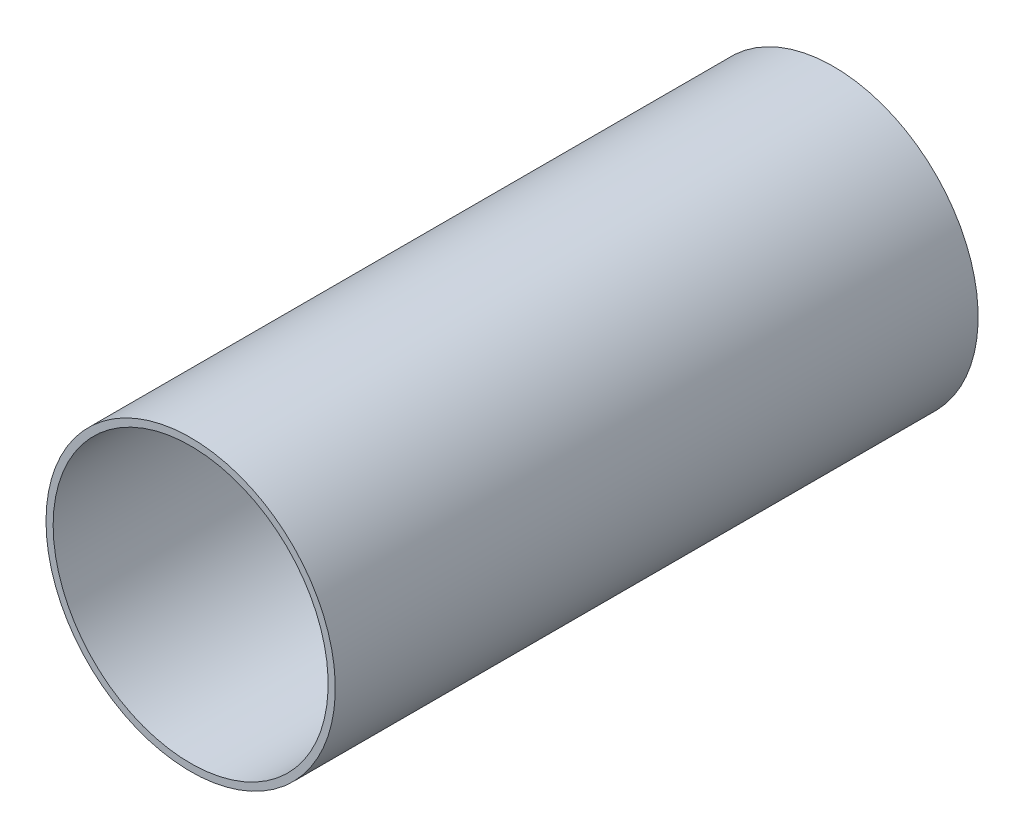
ISO-10303-21;
HEADER;
FILE_DESCRIPTION(('STEP AP214'),'2;1');
FILE_NAME('part.step','',(''),(''),'','','');
FILE_SCHEMA(('AUTOMOTIVE_DESIGN { 1 0 10303 214 1 1 1 1 }'));
ENDSEC;
DATA;
#1=APPLICATION_CONTEXT('core data for automotive mechanical design processes');
#2=APPLICATION_PROTOCOL_DEFINITION('international standard','automotive_design',2000,#1);
#3=PRODUCT_CONTEXT('',#1,'mechanical');
#4=PRODUCT('Part','Part','',(#3));
#5=PRODUCT_RELATED_PRODUCT_CATEGORY('part','',(#4));
#6=PRODUCT_DEFINITION_FORMATION('','',#4);
#7=PRODUCT_DEFINITION_CONTEXT('part definition',#1,'design');
#8=PRODUCT_DEFINITION('design','',#6,#7);
#9=PRODUCT_DEFINITION_SHAPE('','',#8);
#10=(LENGTH_UNIT() NAMED_UNIT(*) SI_UNIT(.MILLI.,.METRE.));
#11=(NAMED_UNIT(*) PLANE_ANGLE_UNIT() SI_UNIT($,.RADIAN.));
#12=(NAMED_UNIT(*) SI_UNIT($,.STERADIAN.) SOLID_ANGLE_UNIT());
#13=UNCERTAINTY_MEASURE_WITH_UNIT(LENGTH_MEASURE(1.E-05),#10,'distance_accuracy_value','');
#14=(GEOMETRIC_REPRESENTATION_CONTEXT(3) GLOBAL_UNCERTAINTY_ASSIGNED_CONTEXT((#13)) GLOBAL_UNIT_ASSIGNED_CONTEXT((#10,
#11,#12)) REPRESENTATION_CONTEXT('',''));
#15=CARTESIAN_POINT('',(0.,0.,0.));
#16=DIRECTION('',(0.,0.,1.));
#17=DIRECTION('',(1.,0.,0.));
#18=AXIS2_PLACEMENT_3D('',#15,#16,#17);
#19=CARTESIAN_POINT('',(0.,0.,90.));
#20=DIRECTION('',(0.,0.,1.));
#21=DIRECTION('',(1.,0.,0.));
#22=AXIS2_PLACEMENT_3D('',#19,#20,#21);
#23=PLANE('',#22);
#24=CARTESIAN_POINT('',(0.,0.,90.));
#25=DIRECTION('',(0.,0.,1.));
#26=DIRECTION('',(1.,0.,0.));
#27=AXIS2_PLACEMENT_3D('',#24,#25,#26);
#28=CIRCLE('',#27,20.25);
#29=CARTESIAN_POINT('',(-20.25,0.,90.));
#30=VERTEX_POINT('',#29);
#31=EDGE_CURVE('E10',#30,#30,#28,.T.);
#32=ORIENTED_EDGE('',*,*,#31,.T.);
#33=EDGE_LOOP('',(#32));
#34=FACE_BOUND('',#33,.T.);
#35=CARTESIAN_POINT('',(0.,0.,90.));
#36=DIRECTION('',(0.,0.,1.));
#37=DIRECTION('',(1.,0.,0.));
#38=AXIS2_PLACEMENT_3D('',#35,#36,#37);
#39=CIRCLE('',#38,19.25);
#40=CARTESIAN_POINT('',(-19.25,0.,90.));
#41=VERTEX_POINT('',#40);
#42=EDGE_CURVE('E42',#41,#41,#39,.T.);
#43=ORIENTED_EDGE('',*,*,#42,.F.);
#44=EDGE_LOOP('',(#43));
#45=FACE_BOUND('',#44,.T.);
#46=ADVANCED_FACE('F31',(#34,#45),#23,.T.);
#47=CARTESIAN_POINT('',(0.,0.,0.));
#48=DIRECTION('',(0.,0.,1.));
#49=DIRECTION('',(1.,0.,0.));
#50=AXIS2_PLACEMENT_3D('',#47,#48,#49);
#51=PLANE('',#50);
#52=CARTESIAN_POINT('',(0.,0.,0.));
#53=DIRECTION('',(0.,0.,1.));
#54=DIRECTION('',(1.,0.,0.));
#55=AXIS2_PLACEMENT_3D('',#52,#53,#54);
#56=CIRCLE('',#55,20.25);
#57=CARTESIAN_POINT('',(-20.25,0.,0.));
#58=VERTEX_POINT('',#57);
#59=EDGE_CURVE('E35',#58,#58,#56,.T.);
#60=ORIENTED_EDGE('',*,*,#59,.F.);
#61=EDGE_LOOP('',(#60));
#62=FACE_BOUND('',#61,.T.);
#63=CARTESIAN_POINT('',(0.,0.,0.));
#64=DIRECTION('',(0.,0.,1.));
#65=DIRECTION('',(1.,0.,0.));
#66=AXIS2_PLACEMENT_3D('',#63,#64,#65);
#67=CIRCLE('',#66,19.25);
#68=CARTESIAN_POINT('',(-19.25,0.,0.));
#69=VERTEX_POINT('',#68);
#70=EDGE_CURVE('E44',#69,#69,#67,.T.);
#71=ORIENTED_EDGE('',*,*,#70,.T.);
#72=EDGE_LOOP('',(#71));
#73=FACE_BOUND('',#72,.T.);
#74=ADVANCED_FACE('F54',(#62,#73),#51,.F.);
#75=CARTESIAN_POINT('',(0.,0.,90.));
#76=DIRECTION('',(0.,0.,-1.));
#77=DIRECTION('',(-1.,0.,0.));
#78=AXIS2_PLACEMENT_3D('',#75,#76,#77);
#79=CYLINDRICAL_SURFACE('',#78,20.25);
#80=CARTESIAN_POINT('',(-20.25,0.,90.));
#81=CARTESIAN_POINT('',(-20.25,0.,89.0625));
#82=CARTESIAN_POINT('',(-20.25,0.,88.125));
#83=CARTESIAN_POINT('',(-20.25,0.,86.25));
#84=CARTESIAN_POINT('',(-20.25,0.,85.3125));
#85=CARTESIAN_POINT('',(-20.25,0.,83.4375));
#86=CARTESIAN_POINT('',(-20.25,0.,82.5));
#87=CARTESIAN_POINT('',(-20.25,0.,80.625));
#88=CARTESIAN_POINT('',(-20.25,0.,79.6875));
#89=CARTESIAN_POINT('',(-20.25,0.,77.8125));
#90=CARTESIAN_POINT('',(-20.25,0.,76.875));
#91=CARTESIAN_POINT('',(-20.25,0.,75.));
#92=CARTESIAN_POINT('',(-20.25,0.,74.0625));
#93=CARTESIAN_POINT('',(-20.25,0.,72.1875));
#94=CARTESIAN_POINT('',(-20.25,0.,71.25));
#95=CARTESIAN_POINT('',(-20.25,0.,69.375));
#96=CARTESIAN_POINT('',(-20.25,0.,68.4375));
#97=CARTESIAN_POINT('',(-20.25,0.,66.5625));
#98=CARTESIAN_POINT('',(-20.25,0.,65.625));
#99=CARTESIAN_POINT('',(-20.25,0.,63.75));
#100=CARTESIAN_POINT('',(-20.25,0.,62.8125));
#101=CARTESIAN_POINT('',(-20.25,0.,60.9375));
#102=CARTESIAN_POINT('',(-20.25,0.,60.));
#103=CARTESIAN_POINT('',(-20.25,0.,58.125));
#104=CARTESIAN_POINT('',(-20.25,0.,57.1875));
#105=CARTESIAN_POINT('',(-20.25,0.,55.3125));
#106=CARTESIAN_POINT('',(-20.25,0.,54.375));
#107=CARTESIAN_POINT('',(-20.25,0.,52.5));
#108=CARTESIAN_POINT('',(-20.25,0.,51.5625));
#109=CARTESIAN_POINT('',(-20.25,0.,49.6875));
#110=CARTESIAN_POINT('',(-20.25,0.,48.75));
#111=CARTESIAN_POINT('',(-20.25,0.,46.875));
#112=CARTESIAN_POINT('',(-20.25,0.,45.9375));
#113=CARTESIAN_POINT('',(-20.25,0.,44.0625));
#114=CARTESIAN_POINT('',(-20.25,0.,43.125));
#115=CARTESIAN_POINT('',(-20.25,0.,41.25));
#116=CARTESIAN_POINT('',(-20.25,0.,40.3125));
#117=CARTESIAN_POINT('',(-20.25,0.,38.4375));
#118=CARTESIAN_POINT('',(-20.25,0.,37.5));
#119=CARTESIAN_POINT('',(-20.25,0.,35.625));
#120=CARTESIAN_POINT('',(-20.25,0.,34.6875));
#121=CARTESIAN_POINT('',(-20.25,0.,32.8125));
#122=CARTESIAN_POINT('',(-20.25,0.,31.875));
#123=CARTESIAN_POINT('',(-20.25,0.,30.));
#124=CARTESIAN_POINT('',(-20.25,0.,29.0625));
#125=CARTESIAN_POINT('',(-20.25,0.,27.1875));
#126=CARTESIAN_POINT('',(-20.25,0.,26.25));
#127=CARTESIAN_POINT('',(-20.25,0.,24.375));
#128=CARTESIAN_POINT('',(-20.25,0.,23.4375));
#129=CARTESIAN_POINT('',(-20.25,0.,21.5625));
#130=CARTESIAN_POINT('',(-20.25,0.,20.625));
#131=CARTESIAN_POINT('',(-20.25,0.,18.75));
#132=CARTESIAN_POINT('',(-20.25,0.,17.8125));
#133=CARTESIAN_POINT('',(-20.25,0.,15.9375));
#134=CARTESIAN_POINT('',(-20.25,0.,15.));
#135=CARTESIAN_POINT('',(-20.25,0.,13.125));
#136=CARTESIAN_POINT('',(-20.25,0.,12.1875));
#137=CARTESIAN_POINT('',(-20.25,0.,10.3125));
#138=CARTESIAN_POINT('',(-20.25,0.,9.37499999999999));
#139=CARTESIAN_POINT('',(-20.25,0.,7.49999999999999));
#140=CARTESIAN_POINT('',(-20.25,0.,6.56249999999999));
#141=CARTESIAN_POINT('',(-20.25,0.,4.68749999999999));
#142=CARTESIAN_POINT('',(-20.25,0.,3.74999999999998));
#143=CARTESIAN_POINT('',(-20.25,0.,1.87499999999998));
#144=CARTESIAN_POINT('',(-20.25,0.,0.937499999999986));
#145=CARTESIAN_POINT('',(-20.25,0.,0.));
#146=B_SPLINE_CURVE_WITH_KNOTS('',3,(#80,#81,#82,#83,#84,#85,#86,#87,#88,#89,#90,#91,#92,#93,
#94,#95,#96,#97,#98,#99,#100,#101,#102,#103,#104,#105,#106,#107,#108,#109,#110,#111,#112,#113,
#114,#115,#116,#117,#118,#119,#120,#121,#122,#123,#124,#125,#126,#127,#128,#129,#130,#131,#132,
#133,#134,#135,#136,#137,#138,#139,#140,#141,#142,#143,#144,#145),.UNSPECIFIED.,.F.,.F.,(4,2,2,
2,2,2,2,2,2,2,2,2,2,2,2,2,2,2,2,2,2,2,2,2,2,2,2,2,2,2,2,2,4),(0.,2.8125,5.62499999999999,
8.43749999999999,11.25,14.0625,16.875,19.6875,22.5,25.3125,28.125,30.9375,33.75,36.5625,39.375,
42.1875,45.,47.8125,50.625,53.4375,56.25,59.0625,61.875,64.6875,67.5,70.3125,73.125,75.9375,
78.75,81.5625,84.375,87.1875,90.),.UNSPECIFIED.);
#147=EDGE_CURVE('BSEAM33',#30,#58,#146,.T.);
#148=ORIENTED_EDGE('',*,*,#31,.F.);
#149=ORIENTED_EDGE('',*,*,#59,.T.);
#150=ORIENTED_EDGE('',*,*,#147,.T.);
#151=ORIENTED_EDGE('',*,*,#147,.F.);
#152=EDGE_LOOP('',(#148,#150,#149,#151));
#153=FACE_BOUND('',#152,.T.);
#154=ADVANCED_FACE('F33',(#153),#79,.T.);
#155=CARTESIAN_POINT('',(0.,0.,90.));
#156=DIRECTION('',(0.,0.,-1.));
#157=DIRECTION('',(-1.,0.,0.));
#158=AXIS2_PLACEMENT_3D('',#155,#156,#157);
#159=CYLINDRICAL_SURFACE('',#158,19.25);
#160=CARTESIAN_POINT('',(-19.25,0.,90.));
#161=CARTESIAN_POINT('',(-19.25,0.,89.0625));
#162=CARTESIAN_POINT('',(-19.25,0.,88.125));
#163=CARTESIAN_POINT('',(-19.25,0.,86.25));
#164=CARTESIAN_POINT('',(-19.25,0.,85.3125));
#165=CARTESIAN_POINT('',(-19.25,0.,83.4375));
#166=CARTESIAN_POINT('',(-19.25,0.,82.5));
#167=CARTESIAN_POINT('',(-19.25,0.,80.625));
#168=CARTESIAN_POINT('',(-19.25,0.,79.6875));
#169=CARTESIAN_POINT('',(-19.25,0.,77.8125));
#170=CARTESIAN_POINT('',(-19.25,0.,76.875));
#171=CARTESIAN_POINT('',(-19.25,0.,75.));
#172=CARTESIAN_POINT('',(-19.25,0.,74.0625));
#173=CARTESIAN_POINT('',(-19.25,0.,72.1875));
#174=CARTESIAN_POINT('',(-19.25,0.,71.25));
#175=CARTESIAN_POINT('',(-19.25,0.,69.375));
#176=CARTESIAN_POINT('',(-19.25,0.,68.4375));
#177=CARTESIAN_POINT('',(-19.25,0.,66.5625));
#178=CARTESIAN_POINT('',(-19.25,0.,65.625));
#179=CARTESIAN_POINT('',(-19.25,0.,63.75));
#180=CARTESIAN_POINT('',(-19.25,0.,62.8125));
#181=CARTESIAN_POINT('',(-19.25,0.,60.9375));
#182=CARTESIAN_POINT('',(-19.25,0.,60.));
#183=CARTESIAN_POINT('',(-19.25,0.,58.125));
#184=CARTESIAN_POINT('',(-19.25,0.,57.1875));
#185=CARTESIAN_POINT('',(-19.25,0.,55.3125));
#186=CARTESIAN_POINT('',(-19.25,0.,54.375));
#187=CARTESIAN_POINT('',(-19.25,0.,52.5));
#188=CARTESIAN_POINT('',(-19.25,0.,51.5625));
#189=CARTESIAN_POINT('',(-19.25,0.,49.6875));
#190=CARTESIAN_POINT('',(-19.25,0.,48.75));
#191=CARTESIAN_POINT('',(-19.25,0.,46.875));
#192=CARTESIAN_POINT('',(-19.25,0.,45.9375));
#193=CARTESIAN_POINT('',(-19.25,0.,44.0625));
#194=CARTESIAN_POINT('',(-19.25,0.,43.125));
#195=CARTESIAN_POINT('',(-19.25,0.,41.25));
#196=CARTESIAN_POINT('',(-19.25,0.,40.3125));
#197=CARTESIAN_POINT('',(-19.25,0.,38.4375));
#198=CARTESIAN_POINT('',(-19.25,0.,37.5));
#199=CARTESIAN_POINT('',(-19.25,0.,35.625));
#200=CARTESIAN_POINT('',(-19.25,0.,34.6875));
#201=CARTESIAN_POINT('',(-19.25,0.,32.8125));
#202=CARTESIAN_POINT('',(-19.25,0.,31.875));
#203=CARTESIAN_POINT('',(-19.25,0.,30.));
#204=CARTESIAN_POINT('',(-19.25,0.,29.0625));
#205=CARTESIAN_POINT('',(-19.25,0.,27.1875));
#206=CARTESIAN_POINT('',(-19.25,0.,26.25));
#207=CARTESIAN_POINT('',(-19.25,0.,24.375));
#208=CARTESIAN_POINT('',(-19.25,0.,23.4375));
#209=CARTESIAN_POINT('',(-19.25,0.,21.5625));
#210=CARTESIAN_POINT('',(-19.25,0.,20.625));
#211=CARTESIAN_POINT('',(-19.25,0.,18.75));
#212=CARTESIAN_POINT('',(-19.25,0.,17.8125));
#213=CARTESIAN_POINT('',(-19.25,0.,15.9375));
#214=CARTESIAN_POINT('',(-19.25,0.,15.));
#215=CARTESIAN_POINT('',(-19.25,0.,13.125));
#216=CARTESIAN_POINT('',(-19.25,0.,12.1875));
#217=CARTESIAN_POINT('',(-19.25,0.,10.3125));
#218=CARTESIAN_POINT('',(-19.25,0.,9.37499999999999));
#219=CARTESIAN_POINT('',(-19.25,0.,7.49999999999999));
#220=CARTESIAN_POINT('',(-19.25,0.,6.56249999999999));
#221=CARTESIAN_POINT('',(-19.25,0.,4.68749999999999));
#222=CARTESIAN_POINT('',(-19.25,0.,3.74999999999998));
#223=CARTESIAN_POINT('',(-19.25,0.,1.87499999999998));
#224=CARTESIAN_POINT('',(-19.25,0.,0.937499999999986));
#225=CARTESIAN_POINT('',(-19.25,0.,0.));
#226=B_SPLINE_CURVE_WITH_KNOTS('',3,(#160,#161,#162,#163,#164,#165,#166,#167,#168,#169,#170,
#171,#172,#173,#174,#175,#176,#177,#178,#179,#180,#181,#182,#183,#184,#185,#186,#187,#188,#189,
#190,#191,#192,#193,#194,#195,#196,#197,#198,#199,#200,#201,#202,#203,#204,#205,#206,#207,#208,
#209,#210,#211,#212,#213,#214,#215,#216,#217,#218,#219,#220,#221,#222,#223,#224,#225),
.UNSPECIFIED.,.F.,.F.,(4,2,2,2,2,2,2,2,2,2,2,2,2,2,2,2,2,2,2,2,2,2,2,2,2,2,2,2,2,2,2,2,4),(0.,
2.81250000000001,5.62500000000001,8.43750000000001,11.25,14.0625,16.875,19.6875,22.5,25.3125,
28.125,30.9375,33.75,36.5625,39.375,42.1875,45.,47.8125,50.625,53.4375,56.25,59.0625,61.875,
64.6875,67.5,70.3125,73.125,75.9375,78.75,81.5625,84.375,87.1875,90.),.UNSPECIFIED.);
#227=EDGE_CURVE('BSEAM50',#41,#69,#226,.T.);
#228=ORIENTED_EDGE('',*,*,#42,.T.);
#229=ORIENTED_EDGE('',*,*,#70,.F.);
#230=ORIENTED_EDGE('',*,*,#227,.T.);
#231=ORIENTED_EDGE('',*,*,#227,.F.);
#232=EDGE_LOOP('',(#228,#230,#229,#231));
#233=FACE_BOUND('',#232,.T.);
#234=ADVANCED_FACE('F50',(#233),#159,.F.);
#235=CLOSED_SHELL('',(#46,#74,#154,#234));
#236=MANIFOLD_SOLID_BREP('B2',#235);
#237=ADVANCED_BREP_SHAPE_REPRESENTATION('',(#18,#236),#14);
#238=SHAPE_DEFINITION_REPRESENTATION(#9,#237);
ENDSEC;
END-ISO-10303-21;
